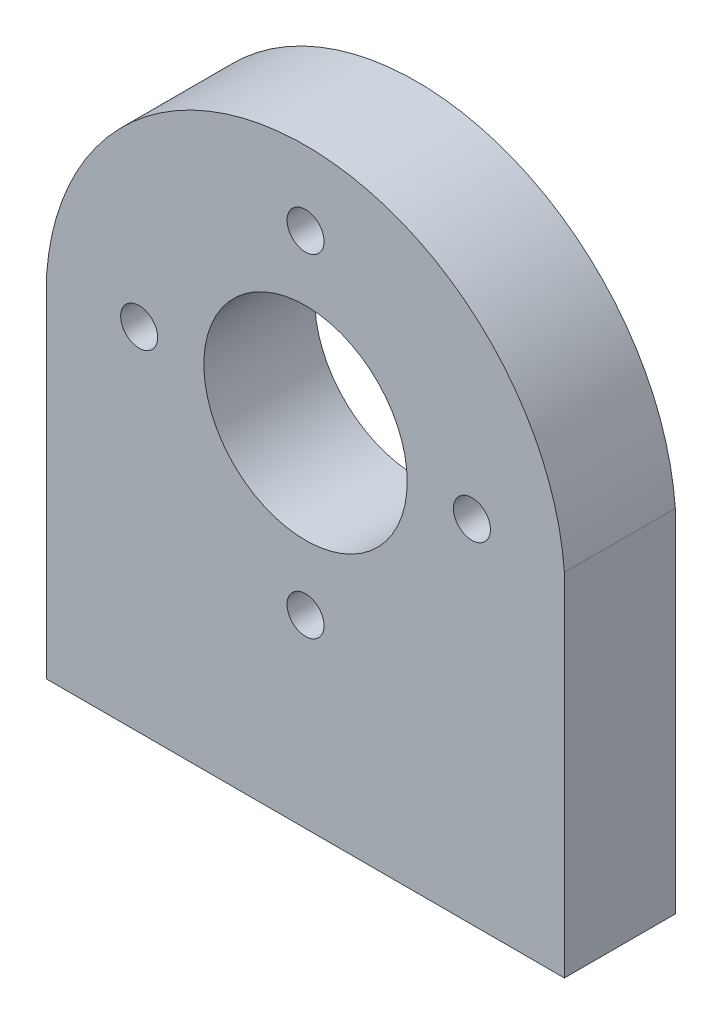
ISO-10303-21;
HEADER;
FILE_DESCRIPTION(('STEP AP214'),'2;1');
FILE_NAME('part.step','',(''),(''),'','','');
FILE_SCHEMA(('AUTOMOTIVE_DESIGN { 1 0 10303 214 1 1 1 1 }'));
ENDSEC;
DATA;
#1=APPLICATION_CONTEXT('core data for automotive mechanical design processes');
#2=APPLICATION_PROTOCOL_DEFINITION('international standard','automotive_design',2000,#1);
#3=PRODUCT_CONTEXT('',#1,'mechanical');
#4=PRODUCT('Part','Part','',(#3));
#5=PRODUCT_RELATED_PRODUCT_CATEGORY('part','',(#4));
#6=PRODUCT_DEFINITION_FORMATION('','',#4);
#7=PRODUCT_DEFINITION_CONTEXT('part definition',#1,'design');
#8=PRODUCT_DEFINITION('design','',#6,#7);
#9=PRODUCT_DEFINITION_SHAPE('','',#8);
#10=(LENGTH_UNIT() NAMED_UNIT(*) SI_UNIT(.MILLI.,.METRE.));
#11=(NAMED_UNIT(*) PLANE_ANGLE_UNIT() SI_UNIT($,.RADIAN.));
#12=(NAMED_UNIT(*) SI_UNIT($,.STERADIAN.) SOLID_ANGLE_UNIT());
#13=UNCERTAINTY_MEASURE_WITH_UNIT(LENGTH_MEASURE(1.E-05),#10,'distance_accuracy_value','');
#14=(GEOMETRIC_REPRESENTATION_CONTEXT(3) GLOBAL_UNCERTAINTY_ASSIGNED_CONTEXT((#13)) GLOBAL_UNIT_ASSIGNED_CONTEXT((#10,
#11,#12)) REPRESENTATION_CONTEXT('',''));
#15=CARTESIAN_POINT('',(0.,0.,0.));
#16=DIRECTION('',(0.,0.,1.));
#17=DIRECTION('',(1.,0.,0.));
#18=AXIS2_PLACEMENT_3D('',#15,#16,#17);
#19=CARTESIAN_POINT('',(0.,0.,6.));
#20=DIRECTION('',(1.,0.,0.));
#21=DIRECTION('',(0.,0.,-1.));
#22=AXIS2_PLACEMENT_3D('',#19,#20,#21);
#23=PLANE('',#22);
#24=DIRECTION('',(0.,-1.,0.));
#25=VECTOR('',#24,1.);
#26=CARTESIAN_POINT('',(0.,0.,6.));
#27=LINE('',#26,#25);
#28=CARTESIAN_POINT('',(0.,19.,6.));
#29=VERTEX_POINT('',#28);
#30=CARTESIAN_POINT('',(0.,0.,6.));
#31=VERTEX_POINT('',#30);
#32=EDGE_CURVE('E84',#29,#31,#27,.T.);
#33=ORIENTED_EDGE('',*,*,#32,.F.);
#34=DIRECTION('',(0.,0.,1.));
#35=VECTOR('',#34,1.);
#36=CARTESIAN_POINT('',(0.,19.,0.));
#37=LINE('',#36,#35);
#38=CARTESIAN_POINT('',(0.,19.,0.));
#39=VERTEX_POINT('',#38);
#40=EDGE_CURVE('E74',#39,#29,#37,.T.);
#41=ORIENTED_EDGE('',*,*,#40,.F.);
#42=DIRECTION('',(0.,-1.,0.));
#43=VECTOR('',#42,1.);
#44=CARTESIAN_POINT('',(0.,0.,0.));
#45=LINE('',#44,#43);
#46=CARTESIAN_POINT('',(0.,0.,0.));
#47=VERTEX_POINT('',#46);
#48=EDGE_CURVE('E60',#39,#47,#45,.T.);
#49=ORIENTED_EDGE('',*,*,#48,.T.);
#50=DIRECTION('',(0.,0.,-1.));
#51=VECTOR('',#50,1.);
#52=CARTESIAN_POINT('',(0.,0.,6.));
#53=LINE('',#52,#51);
#54=EDGE_CURVE('E41',#31,#47,#53,.T.);
#55=ORIENTED_EDGE('',*,*,#54,.F.);
#56=EDGE_LOOP('',(#33,#41,#49,#55));
#57=FACE_BOUND('',#56,.T.);
#58=ADVANCED_FACE('F33',(#57),#23,.F.);
#59=CARTESIAN_POINT('',(0.,0.,6.));
#60=DIRECTION('',(0.,1.,0.));
#61=DIRECTION('',(0.,0.,1.));
#62=AXIS2_PLACEMENT_3D('',#59,#60,#61);
#63=PLANE('',#62);
#64=CARTESIAN_POINT('',(22.,0.,3.));
#65=DIRECTION('',(0.,-1.,0.));
#66=DIRECTION('',(0.,0.,1.));
#67=AXIS2_PLACEMENT_3D('',#64,#65,#66);
#68=CIRCLE('',#67,1.25);
#69=CARTESIAN_POINT('',(22.,0.,4.25));
#70=VERTEX_POINT('',#69);
#71=EDGE_CURVE('E139',#70,#70,#68,.T.);
#72=ORIENTED_EDGE('',*,*,#71,.F.);
#73=EDGE_LOOP('',(#72));
#74=FACE_BOUND('',#73,.T.);
#75=CARTESIAN_POINT('',(6.,0.,3.));
#76=DIRECTION('',(0.,-1.,0.));
#77=DIRECTION('',(0.,0.,-1.));
#78=AXIS2_PLACEMENT_3D('',#75,#76,#77);
#79=CIRCLE('',#78,1.25);
#80=CARTESIAN_POINT('',(6.,0.,1.75));
#81=VERTEX_POINT('',#80);
#82=EDGE_CURVE('E96',#81,#81,#79,.T.);
#83=ORIENTED_EDGE('',*,*,#82,.F.);
#84=EDGE_LOOP('',(#83));
#85=FACE_BOUND('',#84,.T.);
#86=DIRECTION('',(1.,0.,0.));
#87=VECTOR('',#86,1.);
#88=CARTESIAN_POINT('',(0.,0.,0.));
#89=LINE('',#88,#87);
#90=CARTESIAN_POINT('',(28.,0.,0.));
#91=VERTEX_POINT('',#90);
#92=EDGE_CURVE('E93',#47,#91,#89,.T.);
#93=ORIENTED_EDGE('',*,*,#92,.T.);
#94=DIRECTION('',(0.,0.,-1.));
#95=VECTOR('',#94,1.);
#96=CARTESIAN_POINT('',(28.,0.,6.));
#97=LINE('',#96,#95);
#98=CARTESIAN_POINT('',(28.,0.,6.));
#99=VERTEX_POINT('',#98);
#100=EDGE_CURVE('E100',#99,#91,#97,.T.);
#101=ORIENTED_EDGE('',*,*,#100,.F.);
#102=DIRECTION('',(1.,0.,0.));
#103=VECTOR('',#102,1.);
#104=CARTESIAN_POINT('',(0.,0.,6.));
#105=LINE('',#104,#103);
#106=EDGE_CURVE('E49',#31,#99,#105,.T.);
#107=ORIENTED_EDGE('',*,*,#106,.F.);
#108=ORIENTED_EDGE('',*,*,#54,.T.);
#109=EDGE_LOOP('',(#93,#101,#107,#108));
#110=FACE_BOUND('',#109,.T.);
#111=ADVANCED_FACE('F106',(#74,#85,#110),#63,.F.);
#112=CARTESIAN_POINT('',(28.,0.,6.));
#113=DIRECTION('',(-1.,0.,0.));
#114=DIRECTION('',(0.,0.,1.));
#115=AXIS2_PLACEMENT_3D('',#112,#113,#114);
#116=PLANE('',#115);
#117=DIRECTION('',(0.,1.,0.));
#118=VECTOR('',#117,1.);
#119=CARTESIAN_POINT('',(28.,0.,0.));
#120=LINE('',#119,#118);
#121=CARTESIAN_POINT('',(28.,19.,0.));
#122=VERTEX_POINT('',#121);
#123=EDGE_CURVE('E89',#91,#122,#120,.T.);
#124=ORIENTED_EDGE('',*,*,#123,.T.);
#125=DIRECTION('',(0.,0.,1.));
#126=VECTOR('',#125,1.);
#127=CARTESIAN_POINT('',(28.,19.,0.));
#128=LINE('',#127,#126);
#129=CARTESIAN_POINT('',(28.,19.,6.));
#130=VERTEX_POINT('',#129);
#131=EDGE_CURVE('E81',#122,#130,#128,.T.);
#132=ORIENTED_EDGE('',*,*,#131,.T.);
#133=DIRECTION('',(0.,1.,0.));
#134=VECTOR('',#133,1.);
#135=CARTESIAN_POINT('',(28.,0.,6.));
#136=LINE('',#135,#134);
#137=EDGE_CURVE('E86',#99,#130,#136,.T.);
#138=ORIENTED_EDGE('',*,*,#137,.F.);
#139=ORIENTED_EDGE('',*,*,#100,.T.);
#140=EDGE_LOOP('',(#124,#132,#138,#139));
#141=FACE_BOUND('',#140,.T.);
#142=ADVANCED_FACE('F109',(#141),#116,.F.);
#143=CARTESIAN_POINT('',(0.,0.,6.));
#144=DIRECTION('',(0.,0.,-1.));
#145=DIRECTION('',(-1.,0.,0.));
#146=AXIS2_PLACEMENT_3D('',#143,#144,#145);
#147=PLANE('',#146);
#148=CARTESIAN_POINT('',(5.,19.,6.));
#149=DIRECTION('',(0.,0.,1.));
#150=DIRECTION('',(1.,0.,0.));
#151=AXIS2_PLACEMENT_3D('',#148,#149,#150);
#152=CIRCLE('',#151,1.);
#153=CARTESIAN_POINT('',(6.00000000000001,19.,6.));
#154=VERTEX_POINT('',#153);
#155=EDGE_CURVE('E116',#154,#154,#152,.T.);
#156=ORIENTED_EDGE('',*,*,#155,.F.);
#157=EDGE_LOOP('',(#156));
#158=FACE_BOUND('',#157,.T.);
#159=CARTESIAN_POINT('',(14.,28.,6.));
#160=DIRECTION('',(0.,0.,1.));
#161=DIRECTION('',(1.,0.,0.));
#162=AXIS2_PLACEMENT_3D('',#159,#160,#161);
#163=CIRCLE('',#162,1.00000000000001);
#164=CARTESIAN_POINT('',(15.,28.,6.));
#165=VERTEX_POINT('',#164);
#166=EDGE_CURVE('E122',#165,#165,#163,.T.);
#167=ORIENTED_EDGE('',*,*,#166,.F.);
#168=EDGE_LOOP('',(#167));
#169=FACE_BOUND('',#168,.T.);
#170=CARTESIAN_POINT('',(23.,19.,6.));
#171=DIRECTION('',(0.,0.,1.));
#172=DIRECTION('',(1.,0.,0.));
#173=AXIS2_PLACEMENT_3D('',#170,#171,#172);
#174=CIRCLE('',#173,0.999999999999994);
#175=CARTESIAN_POINT('',(24.,19.,6.));
#176=VERTEX_POINT('',#175);
#177=EDGE_CURVE('E80',#176,#176,#174,.T.);
#178=ORIENTED_EDGE('',*,*,#177,.F.);
#179=EDGE_LOOP('',(#178));
#180=FACE_BOUND('',#179,.T.);
#181=CARTESIAN_POINT('',(14.,10.,6.));
#182=DIRECTION('',(0.,0.,1.));
#183=DIRECTION('',(1.,0.,0.));
#184=AXIS2_PLACEMENT_3D('',#181,#182,#183);
#185=CIRCLE('',#184,1.);
#186=CARTESIAN_POINT('',(15.,10.,6.));
#187=VERTEX_POINT('',#186);
#188=EDGE_CURVE('E115',#187,#187,#185,.T.);
#189=ORIENTED_EDGE('',*,*,#188,.F.);
#190=EDGE_LOOP('',(#189));
#191=FACE_BOUND('',#190,.T.);
#192=CARTESIAN_POINT('',(14.,19.,6.));
#193=DIRECTION('',(0.,0.,1.));
#194=DIRECTION('',(1.,0.,0.));
#195=AXIS2_PLACEMENT_3D('',#192,#193,#194);
#196=CIRCLE('',#195,5.5);
#197=CARTESIAN_POINT('',(19.5,19.,6.));
#198=VERTEX_POINT('',#197);
#199=EDGE_CURVE('E133',#198,#198,#196,.T.);
#200=ORIENTED_EDGE('',*,*,#199,.F.);
#201=EDGE_LOOP('',(#200));
#202=FACE_BOUND('',#201,.T.);
#203=ORIENTED_EDGE('',*,*,#137,.T.);
#204=CARTESIAN_POINT('',(14.,17.9615384615385,6.));
#205=DIRECTION('',(0.,0.,-1.));
#206=DIRECTION('',(-1.,0.,0.));
#207=AXIS2_PLACEMENT_3D('',#204,#205,#206);
#208=CIRCLE('',#207,14.0384615384615);
#209=EDGE_CURVE('E77',#29,#130,#208,.T.);
#210=ORIENTED_EDGE('',*,*,#209,.F.);
#211=ORIENTED_EDGE('',*,*,#32,.T.);
#212=ORIENTED_EDGE('',*,*,#106,.T.);
#213=EDGE_LOOP('',(#203,#210,#211,#212));
#214=FACE_BOUND('',#213,.T.);
#215=ADVANCED_FACE('F83',(#158,#169,#180,#191,#202,#214),#147,.F.);
#216=CARTESIAN_POINT('',(0.,0.,0.));
#217=DIRECTION('',(0.,0.,-1.));
#218=DIRECTION('',(-1.,0.,0.));
#219=AXIS2_PLACEMENT_3D('',#216,#217,#218);
#220=PLANE('',#219);
#221=CARTESIAN_POINT('',(14.,17.9615384615385,0.));
#222=DIRECTION('',(0.,0.,-1.));
#223=DIRECTION('',(-1.,0.,0.));
#224=AXIS2_PLACEMENT_3D('',#221,#222,#223);
#225=CIRCLE('',#224,14.0384615384615);
#226=EDGE_CURVE('E11',#122,#39,#225,.F.);
#227=ORIENTED_EDGE('',*,*,#226,.F.);
#228=ORIENTED_EDGE('',*,*,#123,.F.);
#229=ORIENTED_EDGE('',*,*,#92,.F.);
#230=ORIENTED_EDGE('',*,*,#48,.F.);
#231=EDGE_LOOP('',(#227,#228,#229,#230));
#232=FACE_BOUND('',#231,.T.);
#233=CARTESIAN_POINT('',(5.,19.,0.));
#234=DIRECTION('',(0.,0.,1.));
#235=DIRECTION('',(1.,0.,0.));
#236=AXIS2_PLACEMENT_3D('',#233,#234,#235);
#237=CIRCLE('',#236,1.);
#238=CARTESIAN_POINT('',(6.00000000000001,19.,0.));
#239=VERTEX_POINT('',#238);
#240=EDGE_CURVE('E112',#239,#239,#237,.T.);
#241=ORIENTED_EDGE('',*,*,#240,.T.);
#242=EDGE_LOOP('',(#241));
#243=FACE_BOUND('',#242,.T.);
#244=CARTESIAN_POINT('',(14.,28.,0.));
#245=DIRECTION('',(0.,0.,1.));
#246=DIRECTION('',(1.,0.,0.));
#247=AXIS2_PLACEMENT_3D('',#244,#245,#246);
#248=CIRCLE('',#247,1.00000000000001);
#249=CARTESIAN_POINT('',(15.,28.,0.));
#250=VERTEX_POINT('',#249);
#251=EDGE_CURVE('E119',#250,#250,#248,.T.);
#252=ORIENTED_EDGE('',*,*,#251,.T.);
#253=EDGE_LOOP('',(#252));
#254=FACE_BOUND('',#253,.T.);
#255=CARTESIAN_POINT('',(23.,19.,0.));
#256=DIRECTION('',(0.,0.,1.));
#257=DIRECTION('',(1.,0.,0.));
#258=AXIS2_PLACEMENT_3D('',#255,#256,#257);
#259=CIRCLE('',#258,0.999999999999994);
#260=CARTESIAN_POINT('',(24.,19.,0.));
#261=VERTEX_POINT('',#260);
#262=EDGE_CURVE('E125',#261,#261,#259,.T.);
#263=ORIENTED_EDGE('',*,*,#262,.T.);
#264=EDGE_LOOP('',(#263));
#265=FACE_BOUND('',#264,.T.);
#266=CARTESIAN_POINT('',(14.,10.,0.));
#267=DIRECTION('',(0.,0.,1.));
#268=DIRECTION('',(1.,0.,0.));
#269=AXIS2_PLACEMENT_3D('',#266,#267,#268);
#270=CIRCLE('',#269,1.);
#271=CARTESIAN_POINT('',(15.,10.,0.));
#272=VERTEX_POINT('',#271);
#273=EDGE_CURVE('E130',#272,#272,#270,.T.);
#274=ORIENTED_EDGE('',*,*,#273,.T.);
#275=EDGE_LOOP('',(#274));
#276=FACE_BOUND('',#275,.T.);
#277=CARTESIAN_POINT('',(14.,19.,0.));
#278=DIRECTION('',(0.,0.,1.));
#279=DIRECTION('',(1.,0.,0.));
#280=AXIS2_PLACEMENT_3D('',#277,#278,#279);
#281=CIRCLE('',#280,5.5);
#282=CARTESIAN_POINT('',(19.5,19.,0.));
#283=VERTEX_POINT('',#282);
#284=EDGE_CURVE('E136',#283,#283,#281,.T.);
#285=ORIENTED_EDGE('',*,*,#284,.T.);
#286=EDGE_LOOP('',(#285));
#287=FACE_BOUND('',#286,.T.);
#288=ADVANCED_FACE('F163',(#232,#243,#254,#265,#276,#287),#220,.T.);
#289=CARTESIAN_POINT('',(6.,10.,3.));
#290=DIRECTION('',(0.,-1.,0.));
#291=DIRECTION('',(0.,0.,-1.));
#292=AXIS2_PLACEMENT_3D('',#289,#290,#291);
#293=CYLINDRICAL_SURFACE('',#292,1.25);
#294=CARTESIAN_POINT('',(6.,10.,3.));
#295=DIRECTION('',(0.,-1.,0.));
#296=DIRECTION('',(0.,0.,-1.));
#297=AXIS2_PLACEMENT_3D('',#294,#295,#296);
#298=CIRCLE('',#297,1.25);
#299=CARTESIAN_POINT('',(6.,10.,1.75));
#300=VERTEX_POINT('',#299);
#301=EDGE_CURVE('E102',#300,#300,#298,.T.);
#302=ORIENTED_EDGE('',*,*,#301,.F.);
#303=EDGE_LOOP('',(#302));
#304=FACE_BOUND('',#303,.T.);
#305=ORIENTED_EDGE('',*,*,#82,.T.);
#306=EDGE_LOOP('',(#305));
#307=FACE_BOUND('',#306,.T.);
#308=ADVANCED_FACE('F152',(#304,#307),#293,.F.);
#309=CARTESIAN_POINT('',(6.,10.,3.));
#310=DIRECTION('',(0.,-1.,0.));
#311=DIRECTION('',(0.,0.,-1.));
#312=AXIS2_PLACEMENT_3D('',#309,#310,#311);
#313=PLANE('',#312);
#314=ORIENTED_EDGE('',*,*,#301,.T.);
#315=EDGE_LOOP('',(#314));
#316=FACE_BOUND('',#315,.T.);
#317=ADVANCED_FACE('F172',(#316),#313,.T.);
#318=CARTESIAN_POINT('',(22.,10.,3.));
#319=DIRECTION('',(0.,-1.,0.));
#320=DIRECTION('',(0.,0.,-1.));
#321=AXIS2_PLACEMENT_3D('',#318,#319,#320);
#322=CYLINDRICAL_SURFACE('',#321,1.25);
#323=CARTESIAN_POINT('',(22.,10.,3.));
#324=DIRECTION('',(0.,-1.,0.));
#325=DIRECTION('',(0.,0.,1.));
#326=AXIS2_PLACEMENT_3D('',#323,#324,#325);
#327=CIRCLE('',#326,1.25);
#328=CARTESIAN_POINT('',(22.,10.,4.25));
#329=VERTEX_POINT('',#328);
#330=EDGE_CURVE('E142',#329,#329,#327,.T.);
#331=ORIENTED_EDGE('',*,*,#330,.F.);
#332=EDGE_LOOP('',(#331));
#333=FACE_BOUND('',#332,.T.);
#334=ORIENTED_EDGE('',*,*,#71,.T.);
#335=EDGE_LOOP('',(#334));
#336=FACE_BOUND('',#335,.T.);
#337=ADVANCED_FACE('F176',(#333,#336),#322,.F.);
#338=CARTESIAN_POINT('',(22.,10.,3.));
#339=DIRECTION('',(0.,1.,0.));
#340=DIRECTION('',(0.,0.,1.));
#341=AXIS2_PLACEMENT_3D('',#338,#339,#340);
#342=PLANE('',#341);
#343=ORIENTED_EDGE('',*,*,#330,.T.);
#344=EDGE_LOOP('',(#343));
#345=FACE_BOUND('',#344,.T.);
#346=ADVANCED_FACE('F179',(#345),#342,.F.);
#347=CARTESIAN_POINT('',(14.,19.,0.));
#348=DIRECTION('',(0.,0.,1.));
#349=DIRECTION('',(1.,0.,0.));
#350=AXIS2_PLACEMENT_3D('',#347,#348,#349);
#351=CYLINDRICAL_SURFACE('',#350,5.5);
#352=ORIENTED_EDGE('',*,*,#284,.F.);
#353=EDGE_LOOP('',(#352));
#354=FACE_BOUND('',#353,.T.);
#355=ORIENTED_EDGE('',*,*,#199,.T.);
#356=EDGE_LOOP('',(#355));
#357=FACE_BOUND('',#356,.T.);
#358=ADVANCED_FACE('F183',(#354,#357),#351,.F.);
#359=CARTESIAN_POINT('',(14.,10.,0.));
#360=DIRECTION('',(0.,0.,1.));
#361=DIRECTION('',(1.,0.,0.));
#362=AXIS2_PLACEMENT_3D('',#359,#360,#361);
#363=CYLINDRICAL_SURFACE('',#362,1.);
#364=ORIENTED_EDGE('',*,*,#273,.F.);
#365=EDGE_LOOP('',(#364));
#366=FACE_BOUND('',#365,.T.);
#367=ORIENTED_EDGE('',*,*,#188,.T.);
#368=EDGE_LOOP('',(#367));
#369=FACE_BOUND('',#368,.T.);
#370=ADVANCED_FACE('F187',(#366,#369),#363,.F.);
#371=CARTESIAN_POINT('',(23.,19.,0.));
#372=DIRECTION('',(0.,0.,1.));
#373=DIRECTION('',(1.,0.,0.));
#374=AXIS2_PLACEMENT_3D('',#371,#372,#373);
#375=CYLINDRICAL_SURFACE('',#374,0.999999999999994);
#376=ORIENTED_EDGE('',*,*,#262,.F.);
#377=EDGE_LOOP('',(#376));
#378=FACE_BOUND('',#377,.T.);
#379=ORIENTED_EDGE('',*,*,#177,.T.);
#380=EDGE_LOOP('',(#379));
#381=FACE_BOUND('',#380,.T.);
#382=ADVANCED_FACE('F191',(#378,#381),#375,.F.);
#383=CARTESIAN_POINT('',(14.,28.,0.));
#384=DIRECTION('',(0.,0.,1.));
#385=DIRECTION('',(1.,0.,0.));
#386=AXIS2_PLACEMENT_3D('',#383,#384,#385);
#387=CYLINDRICAL_SURFACE('',#386,1.00000000000001);
#388=ORIENTED_EDGE('',*,*,#251,.F.);
#389=EDGE_LOOP('',(#388));
#390=FACE_BOUND('',#389,.T.);
#391=ORIENTED_EDGE('',*,*,#166,.T.);
#392=EDGE_LOOP('',(#391));
#393=FACE_BOUND('',#392,.T.);
#394=ADVANCED_FACE('F195',(#390,#393),#387,.F.);
#395=CARTESIAN_POINT('',(5.,19.,0.));
#396=DIRECTION('',(0.,0.,1.));
#397=DIRECTION('',(1.,0.,0.));
#398=AXIS2_PLACEMENT_3D('',#395,#396,#397);
#399=CYLINDRICAL_SURFACE('',#398,1.);
#400=ORIENTED_EDGE('',*,*,#240,.F.);
#401=EDGE_LOOP('',(#400));
#402=FACE_BOUND('',#401,.T.);
#403=ORIENTED_EDGE('',*,*,#155,.T.);
#404=EDGE_LOOP('',(#403));
#405=FACE_BOUND('',#404,.T.);
#406=ADVANCED_FACE('F199',(#402,#405),#399,.F.);
#407=CARTESIAN_POINT('',(14.,17.9615384615385,0.));
#408=DIRECTION('',(0.,0.,1.));
#409=DIRECTION('',(1.,0.,0.));
#410=AXIS2_PLACEMENT_3D('',#407,#408,#409);
#411=CYLINDRICAL_SURFACE('',#410,14.0384615384615);
#412=ORIENTED_EDGE('',*,*,#209,.T.);
#413=ORIENTED_EDGE('',*,*,#131,.F.);
#414=ORIENTED_EDGE('',*,*,#226,.T.);
#415=ORIENTED_EDGE('',*,*,#40,.T.);
#416=EDGE_LOOP('',(#412,#413,#414,#415));
#417=FACE_BOUND('',#416,.T.);
#418=ADVANCED_FACE('F76',(#417),#411,.T.);
#419=CLOSED_SHELL('',(#58,#111,#142,#215,#288,#308,#317,#337,#346,#358,#370,#382,#394,#406,#418));
#420=MANIFOLD_SOLID_BREP('B2',#419);
#421=ADVANCED_BREP_SHAPE_REPRESENTATION('',(#18,#420),#14);
#422=SHAPE_DEFINITION_REPRESENTATION(#9,#421);
ENDSEC;
END-ISO-10303-21;
